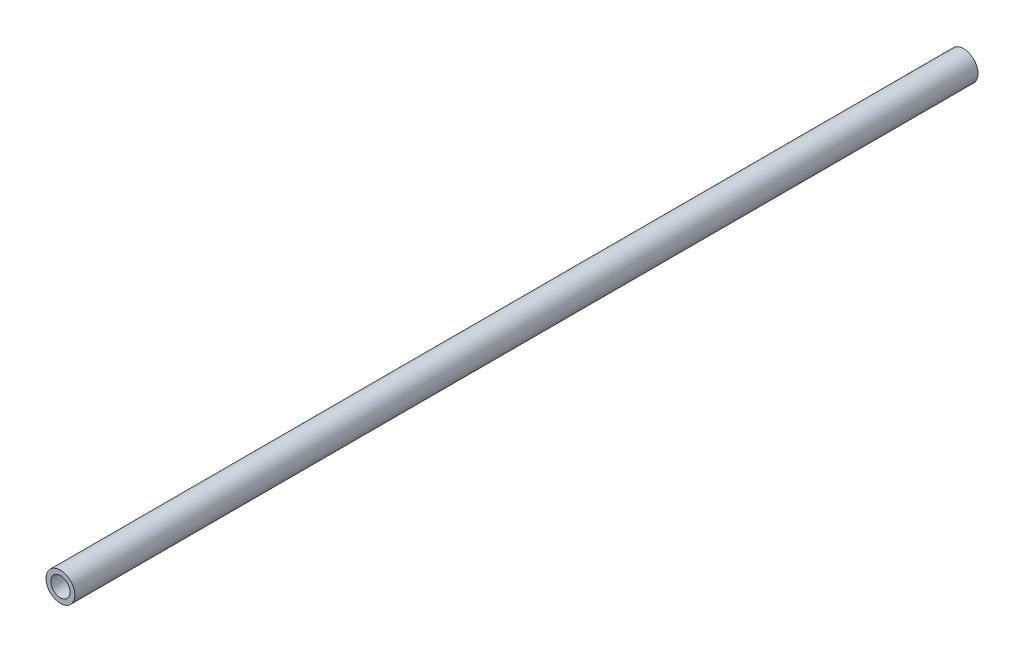
ISO-10303-21;
HEADER;
FILE_DESCRIPTION(('STEP AP214'),'2;1');
FILE_NAME('part.step','',(''),(''),'','','');
FILE_SCHEMA(('AUTOMOTIVE_DESIGN { 1 0 10303 214 1 1 1 1 }'));
ENDSEC;
DATA;
#1=APPLICATION_CONTEXT('core data for automotive mechanical design processes');
#2=APPLICATION_PROTOCOL_DEFINITION('international standard','automotive_design',2000,#1);
#3=PRODUCT_CONTEXT('',#1,'mechanical');
#4=PRODUCT('Part','Part','',(#3));
#5=PRODUCT_RELATED_PRODUCT_CATEGORY('part','',(#4));
#6=PRODUCT_DEFINITION_FORMATION('','',#4);
#7=PRODUCT_DEFINITION_CONTEXT('part definition',#1,'design');
#8=PRODUCT_DEFINITION('design','',#6,#7);
#9=PRODUCT_DEFINITION_SHAPE('','',#8);
#10=(LENGTH_UNIT() NAMED_UNIT(*) SI_UNIT(.MILLI.,.METRE.));
#11=(NAMED_UNIT(*) PLANE_ANGLE_UNIT() SI_UNIT($,.RADIAN.));
#12=(NAMED_UNIT(*) SI_UNIT($,.STERADIAN.) SOLID_ANGLE_UNIT());
#13=UNCERTAINTY_MEASURE_WITH_UNIT(LENGTH_MEASURE(1.E-05),#10,'distance_accuracy_value','');
#14=(GEOMETRIC_REPRESENTATION_CONTEXT(3) GLOBAL_UNCERTAINTY_ASSIGNED_CONTEXT((#13)) GLOBAL_UNIT_ASSIGNED_CONTEXT((#10,
#11,#12)) REPRESENTATION_CONTEXT('',''));
#15=CARTESIAN_POINT('',(0.,0.,0.));
#16=DIRECTION('',(0.,0.,1.));
#17=DIRECTION('',(1.,0.,0.));
#18=AXIS2_PLACEMENT_3D('',#15,#16,#17);
#19=CARTESIAN_POINT('',(390.761403900086,31.0815288811455,470.));
#20=DIRECTION('',(0.,0.,1.));
#21=DIRECTION('',(1.,0.,0.));
#22=AXIS2_PLACEMENT_3D('',#19,#20,#21);
#23=PLANE('',#22);
#24=CARTESIAN_POINT('',(390.761403900086,31.0815288811455,470.));
#25=DIRECTION('',(0.,0.,1.));
#26=DIRECTION('',(1.,0.,0.));
#27=AXIS2_PLACEMENT_3D('',#24,#25,#26);
#28=CIRCLE('',#27,7.50000000000001);
#29=CARTESIAN_POINT('',(383.261403900086,31.0815288811455,470.));
#30=VERTEX_POINT('',#29);
#31=EDGE_CURVE('E10',#30,#30,#28,.T.);
#32=ORIENTED_EDGE('',*,*,#31,.T.);
#33=EDGE_LOOP('',(#32));
#34=FACE_BOUND('',#33,.T.);
#35=CARTESIAN_POINT('',(390.761403900086,31.0815288811455,470.));
#36=DIRECTION('',(0.,0.,1.));
#37=DIRECTION('',(1.,0.,0.));
#38=AXIS2_PLACEMENT_3D('',#35,#36,#37);
#39=CIRCLE('',#38,4.99999999999999);
#40=CARTESIAN_POINT('',(385.761403900086,31.0815288811455,470.));
#41=VERTEX_POINT('',#40);
#42=EDGE_CURVE('E40',#41,#41,#39,.T.);
#43=ORIENTED_EDGE('',*,*,#42,.F.);
#44=EDGE_LOOP('',(#43));
#45=FACE_BOUND('',#44,.T.);
#46=ADVANCED_FACE('F29',(#34,#45),#23,.T.);
#47=CARTESIAN_POINT('',(390.761403900086,31.0815288811455,0.));
#48=DIRECTION('',(0.,0.,1.));
#49=DIRECTION('',(1.,0.,0.));
#50=AXIS2_PLACEMENT_3D('',#47,#48,#49);
#51=PLANE('',#50);
#52=CARTESIAN_POINT('',(390.761403900086,31.0815288811455,0.));
#53=DIRECTION('',(0.,0.,1.));
#54=DIRECTION('',(1.,0.,0.));
#55=AXIS2_PLACEMENT_3D('',#52,#53,#54);
#56=CIRCLE('',#55,7.50000000000001);
#57=CARTESIAN_POINT('',(383.261403900086,31.0815288811455,0.));
#58=VERTEX_POINT('',#57);
#59=EDGE_CURVE('E33',#58,#58,#56,.T.);
#60=ORIENTED_EDGE('',*,*,#59,.F.);
#61=EDGE_LOOP('',(#60));
#62=FACE_BOUND('',#61,.T.);
#63=CARTESIAN_POINT('',(390.761403900086,31.0815288811455,0.));
#64=DIRECTION('',(0.,0.,1.));
#65=DIRECTION('',(1.,0.,0.));
#66=AXIS2_PLACEMENT_3D('',#63,#64,#65);
#67=CIRCLE('',#66,4.99999999999999);
#68=CARTESIAN_POINT('',(385.761403900086,31.0815288811455,0.));
#69=VERTEX_POINT('',#68);
#70=EDGE_CURVE('E42',#69,#69,#67,.T.);
#71=ORIENTED_EDGE('',*,*,#70,.T.);
#72=EDGE_LOOP('',(#71));
#73=FACE_BOUND('',#72,.T.);
#74=ADVANCED_FACE('F52',(#62,#73),#51,.F.);
#75=CARTESIAN_POINT('',(390.761403900086,31.0815288811455,470.));
#76=DIRECTION('',(0.,0.,-1.));
#77=DIRECTION('',(-1.,0.,0.));
#78=AXIS2_PLACEMENT_3D('',#75,#76,#77);
#79=CYLINDRICAL_SURFACE('',#78,7.50000000000001);
#80=CARTESIAN_POINT('',(383.261403900086,31.0815288811455,470.));
#81=CARTESIAN_POINT('',(383.261403900086,31.0815288811455,465.104166666667));
#82=CARTESIAN_POINT('',(383.261403900086,31.0815288811455,460.208333333333));
#83=CARTESIAN_POINT('',(383.261403900086,31.0815288811455,450.416666666667));
#84=CARTESIAN_POINT('',(383.261403900086,31.0815288811455,445.520833333333));
#85=CARTESIAN_POINT('',(383.261403900086,31.0815288811455,435.729166666667));
#86=CARTESIAN_POINT('',(383.261403900086,31.0815288811455,430.833333333333));
#87=CARTESIAN_POINT('',(383.261403900086,31.0815288811455,421.041666666667));
#88=CARTESIAN_POINT('',(383.261403900086,31.0815288811455,416.145833333333));
#89=CARTESIAN_POINT('',(383.261403900086,31.0815288811455,406.354166666667));
#90=CARTESIAN_POINT('',(383.261403900086,31.0815288811455,401.458333333333));
#91=CARTESIAN_POINT('',(383.261403900086,31.0815288811455,391.666666666667));
#92=CARTESIAN_POINT('',(383.261403900086,31.0815288811455,386.770833333333));
#93=CARTESIAN_POINT('',(383.261403900086,31.0815288811455,376.979166666667));
#94=CARTESIAN_POINT('',(383.261403900086,31.0815288811455,372.083333333333));
#95=CARTESIAN_POINT('',(383.261403900086,31.0815288811455,362.291666666667));
#96=CARTESIAN_POINT('',(383.261403900086,31.0815288811455,357.395833333333));
#97=CARTESIAN_POINT('',(383.261403900086,31.0815288811455,347.604166666667));
#98=CARTESIAN_POINT('',(383.261403900086,31.0815288811455,342.708333333333));
#99=CARTESIAN_POINT('',(383.261403900086,31.0815288811455,332.916666666667));
#100=CARTESIAN_POINT('',(383.261403900086,31.0815288811455,328.020833333333));
#101=CARTESIAN_POINT('',(383.261403900086,31.0815288811455,318.229166666667));
#102=CARTESIAN_POINT('',(383.261403900086,31.0815288811455,313.333333333333));
#103=CARTESIAN_POINT('',(383.261403900086,31.0815288811455,303.541666666667));
#104=CARTESIAN_POINT('',(383.261403900086,31.0815288811455,298.645833333333));
#105=CARTESIAN_POINT('',(383.261403900086,31.0815288811455,288.854166666667));
#106=CARTESIAN_POINT('',(383.261403900086,31.0815288811455,283.958333333333));
#107=CARTESIAN_POINT('',(383.261403900086,31.0815288811455,274.166666666667));
#108=CARTESIAN_POINT('',(383.261403900086,31.0815288811455,269.270833333333));
#109=CARTESIAN_POINT('',(383.261403900086,31.0815288811455,259.479166666667));
#110=CARTESIAN_POINT('',(383.261403900086,31.0815288811455,254.583333333333));
#111=CARTESIAN_POINT('',(383.261403900086,31.0815288811455,244.791666666667));
#112=CARTESIAN_POINT('',(383.261403900086,31.0815288811455,239.895833333333));
#113=CARTESIAN_POINT('',(383.261403900086,31.0815288811455,230.104166666667));
#114=CARTESIAN_POINT('',(383.261403900086,31.0815288811455,225.208333333333));
#115=CARTESIAN_POINT('',(383.261403900086,31.0815288811455,215.416666666667));
#116=CARTESIAN_POINT('',(383.261403900086,31.0815288811455,210.520833333333));
#117=CARTESIAN_POINT('',(383.261403900086,31.0815288811455,200.729166666667));
#118=CARTESIAN_POINT('',(383.261403900086,31.0815288811455,195.833333333333));
#119=CARTESIAN_POINT('',(383.261403900086,31.0815288811455,186.041666666667));
#120=CARTESIAN_POINT('',(383.261403900086,31.0815288811455,181.145833333333));
#121=CARTESIAN_POINT('',(383.261403900086,31.0815288811455,171.354166666667));
#122=CARTESIAN_POINT('',(383.261403900086,31.0815288811455,166.458333333333));
#123=CARTESIAN_POINT('',(383.261403900086,31.0815288811455,156.666666666667));
#124=CARTESIAN_POINT('',(383.261403900086,31.0815288811455,151.770833333333));
#125=CARTESIAN_POINT('',(383.261403900086,31.0815288811455,141.979166666667));
#126=CARTESIAN_POINT('',(383.261403900086,31.0815288811455,137.083333333333));
#127=CARTESIAN_POINT('',(383.261403900086,31.0815288811455,127.291666666667));
#128=CARTESIAN_POINT('',(383.261403900086,31.0815288811455,122.395833333333));
#129=CARTESIAN_POINT('',(383.261403900086,31.0815288811455,112.604166666667));
#130=CARTESIAN_POINT('',(383.261403900086,31.0815288811455,107.708333333333));
#131=CARTESIAN_POINT('',(383.261403900086,31.0815288811455,97.9166666666666));
#132=CARTESIAN_POINT('',(383.261403900086,31.0815288811455,93.0208333333333));
#133=CARTESIAN_POINT('',(383.261403900086,31.0815288811455,83.2291666666666));
#134=CARTESIAN_POINT('',(383.261403900086,31.0815288811455,78.3333333333333));
#135=CARTESIAN_POINT('',(383.261403900086,31.0815288811455,68.5416666666666));
#136=CARTESIAN_POINT('',(383.261403900086,31.0815288811455,63.6458333333333));
#137=CARTESIAN_POINT('',(383.261403900086,31.0815288811455,53.8541666666666));
#138=CARTESIAN_POINT('',(383.261403900086,31.0815288811455,48.9583333333333));
#139=CARTESIAN_POINT('',(383.261403900086,31.0815288811455,39.1666666666666));
#140=CARTESIAN_POINT('',(383.261403900086,31.0815288811455,34.2708333333333));
#141=CARTESIAN_POINT('',(383.261403900086,31.0815288811455,24.4791666666666));
#142=CARTESIAN_POINT('',(383.261403900086,31.0815288811455,19.5833333333333));
#143=CARTESIAN_POINT('',(383.261403900086,31.0815288811455,9.79166666666662));
#144=CARTESIAN_POINT('',(383.261403900086,31.0815288811455,4.89583333333328));
#145=CARTESIAN_POINT('',(383.261403900086,31.0815288811455,0.));
#146=B_SPLINE_CURVE_WITH_KNOTS('',3,(#80,#81,#82,#83,#84,#85,#86,#87,#88,#89,#90,#91,#92,#93,
#94,#95,#96,#97,#98,#99,#100,#101,#102,#103,#104,#105,#106,#107,#108,#109,#110,#111,#112,#113,
#114,#115,#116,#117,#118,#119,#120,#121,#122,#123,#124,#125,#126,#127,#128,#129,#130,#131,#132,
#133,#134,#135,#136,#137,#138,#139,#140,#141,#142,#143,#144,#145),.UNSPECIFIED.,.F.,.F.,(4,2,2,
2,2,2,2,2,2,2,2,2,2,2,2,2,2,2,2,2,2,2,2,2,2,2,2,2,2,2,2,2,4),(0.,14.6875,29.375,44.0625,58.75,
73.4375,88.125,102.8125,117.5,132.1875,146.875,161.5625,176.25,190.9375,205.625,220.3125,235.,
249.6875,264.375,279.0625,293.75,308.4375,323.125,337.8125,352.5,367.1875,381.875,396.5625,
411.25,425.9375,440.625,455.3125,470.),.UNSPECIFIED.);
#147=EDGE_CURVE('BSEAM31',#30,#58,#146,.T.);
#148=ORIENTED_EDGE('',*,*,#31,.F.);
#149=ORIENTED_EDGE('',*,*,#59,.T.);
#150=ORIENTED_EDGE('',*,*,#147,.T.);
#151=ORIENTED_EDGE('',*,*,#147,.F.);
#152=EDGE_LOOP('',(#148,#150,#149,#151));
#153=FACE_BOUND('',#152,.T.);
#154=ADVANCED_FACE('F31',(#153),#79,.T.);
#155=CARTESIAN_POINT('',(390.761403900086,31.0815288811455,470.));
#156=DIRECTION('',(0.,0.,-1.));
#157=DIRECTION('',(-1.,0.,0.));
#158=AXIS2_PLACEMENT_3D('',#155,#156,#157);
#159=CYLINDRICAL_SURFACE('',#158,4.99999999999999);
#160=CARTESIAN_POINT('',(385.761403900086,31.0815288811455,470.));
#161=CARTESIAN_POINT('',(385.761403900086,31.0815288811455,465.104166666667));
#162=CARTESIAN_POINT('',(385.761403900086,31.0815288811455,460.208333333333));
#163=CARTESIAN_POINT('',(385.761403900086,31.0815288811455,450.416666666667));
#164=CARTESIAN_POINT('',(385.761403900086,31.0815288811455,445.520833333333));
#165=CARTESIAN_POINT('',(385.761403900086,31.0815288811455,435.729166666667));
#166=CARTESIAN_POINT('',(385.761403900086,31.0815288811455,430.833333333333));
#167=CARTESIAN_POINT('',(385.761403900086,31.0815288811455,421.041666666667));
#168=CARTESIAN_POINT('',(385.761403900086,31.0815288811455,416.145833333333));
#169=CARTESIAN_POINT('',(385.761403900086,31.0815288811455,406.354166666667));
#170=CARTESIAN_POINT('',(385.761403900086,31.0815288811455,401.458333333333));
#171=CARTESIAN_POINT('',(385.761403900086,31.0815288811455,391.666666666667));
#172=CARTESIAN_POINT('',(385.761403900086,31.0815288811455,386.770833333333));
#173=CARTESIAN_POINT('',(385.761403900086,31.0815288811455,376.979166666667));
#174=CARTESIAN_POINT('',(385.761403900086,31.0815288811455,372.083333333333));
#175=CARTESIAN_POINT('',(385.761403900086,31.0815288811455,362.291666666667));
#176=CARTESIAN_POINT('',(385.761403900086,31.0815288811455,357.395833333333));
#177=CARTESIAN_POINT('',(385.761403900086,31.0815288811455,347.604166666667));
#178=CARTESIAN_POINT('',(385.761403900086,31.0815288811455,342.708333333333));
#179=CARTESIAN_POINT('',(385.761403900086,31.0815288811455,332.916666666667));
#180=CARTESIAN_POINT('',(385.761403900086,31.0815288811455,328.020833333333));
#181=CARTESIAN_POINT('',(385.761403900086,31.0815288811455,318.229166666667));
#182=CARTESIAN_POINT('',(385.761403900086,31.0815288811455,313.333333333333));
#183=CARTESIAN_POINT('',(385.761403900086,31.0815288811455,303.541666666667));
#184=CARTESIAN_POINT('',(385.761403900086,31.0815288811455,298.645833333333));
#185=CARTESIAN_POINT('',(385.761403900086,31.0815288811455,288.854166666667));
#186=CARTESIAN_POINT('',(385.761403900086,31.0815288811455,283.958333333333));
#187=CARTESIAN_POINT('',(385.761403900086,31.0815288811455,274.166666666667));
#188=CARTESIAN_POINT('',(385.761403900086,31.0815288811455,269.270833333333));
#189=CARTESIAN_POINT('',(385.761403900086,31.0815288811455,259.479166666667));
#190=CARTESIAN_POINT('',(385.761403900086,31.0815288811455,254.583333333333));
#191=CARTESIAN_POINT('',(385.761403900086,31.0815288811455,244.791666666667));
#192=CARTESIAN_POINT('',(385.761403900086,31.0815288811455,239.895833333333));
#193=CARTESIAN_POINT('',(385.761403900086,31.0815288811455,230.104166666667));
#194=CARTESIAN_POINT('',(385.761403900086,31.0815288811455,225.208333333333));
#195=CARTESIAN_POINT('',(385.761403900086,31.0815288811455,215.416666666667));
#196=CARTESIAN_POINT('',(385.761403900086,31.0815288811455,210.520833333333));
#197=CARTESIAN_POINT('',(385.761403900086,31.0815288811455,200.729166666667));
#198=CARTESIAN_POINT('',(385.761403900086,31.0815288811455,195.833333333333));
#199=CARTESIAN_POINT('',(385.761403900086,31.0815288811455,186.041666666667));
#200=CARTESIAN_POINT('',(385.761403900086,31.0815288811455,181.145833333333));
#201=CARTESIAN_POINT('',(385.761403900086,31.0815288811455,171.354166666667));
#202=CARTESIAN_POINT('',(385.761403900086,31.0815288811455,166.458333333333));
#203=CARTESIAN_POINT('',(385.761403900086,31.0815288811455,156.666666666667));
#204=CARTESIAN_POINT('',(385.761403900086,31.0815288811455,151.770833333333));
#205=CARTESIAN_POINT('',(385.761403900086,31.0815288811455,141.979166666667));
#206=CARTESIAN_POINT('',(385.761403900086,31.0815288811455,137.083333333333));
#207=CARTESIAN_POINT('',(385.761403900086,31.0815288811455,127.291666666667));
#208=CARTESIAN_POINT('',(385.761403900086,31.0815288811455,122.395833333333));
#209=CARTESIAN_POINT('',(385.761403900086,31.0815288811455,112.604166666667));
#210=CARTESIAN_POINT('',(385.761403900086,31.0815288811455,107.708333333333));
#211=CARTESIAN_POINT('',(385.761403900086,31.0815288811455,97.9166666666666));
#212=CARTESIAN_POINT('',(385.761403900086,31.0815288811455,93.0208333333333));
#213=CARTESIAN_POINT('',(385.761403900086,31.0815288811455,83.2291666666666));
#214=CARTESIAN_POINT('',(385.761403900086,31.0815288811455,78.3333333333333));
#215=CARTESIAN_POINT('',(385.761403900086,31.0815288811455,68.5416666666666));
#216=CARTESIAN_POINT('',(385.761403900086,31.0815288811455,63.6458333333333));
#217=CARTESIAN_POINT('',(385.761403900086,31.0815288811455,53.8541666666666));
#218=CARTESIAN_POINT('',(385.761403900086,31.0815288811455,48.9583333333333));
#219=CARTESIAN_POINT('',(385.761403900086,31.0815288811455,39.1666666666666));
#220=CARTESIAN_POINT('',(385.761403900086,31.0815288811455,34.2708333333333));
#221=CARTESIAN_POINT('',(385.761403900086,31.0815288811455,24.4791666666666));
#222=CARTESIAN_POINT('',(385.761403900086,31.0815288811455,19.5833333333333));
#223=CARTESIAN_POINT('',(385.761403900086,31.0815288811455,9.79166666666662));
#224=CARTESIAN_POINT('',(385.761403900086,31.0815288811455,4.89583333333328));
#225=CARTESIAN_POINT('',(385.761403900086,31.0815288811455,0.));
#226=B_SPLINE_CURVE_WITH_KNOTS('',3,(#160,#161,#162,#163,#164,#165,#166,#167,#168,#169,#170,
#171,#172,#173,#174,#175,#176,#177,#178,#179,#180,#181,#182,#183,#184,#185,#186,#187,#188,#189,
#190,#191,#192,#193,#194,#195,#196,#197,#198,#199,#200,#201,#202,#203,#204,#205,#206,#207,#208,
#209,#210,#211,#212,#213,#214,#215,#216,#217,#218,#219,#220,#221,#222,#223,#224,#225),
.UNSPECIFIED.,.F.,.F.,(4,2,2,2,2,2,2,2,2,2,2,2,2,2,2,2,2,2,2,2,2,2,2,2,2,2,2,2,2,2,2,2,4),(0.,
14.6875,29.375,44.0625,58.75,73.4375,88.125,102.8125,117.5,132.1875,146.875,161.5625,176.25,
190.9375,205.625,220.3125,235.,249.6875,264.375,279.0625,293.75,308.4375,323.125,337.8125,352.5,
367.1875,381.875,396.5625,411.25,425.9375,440.625,455.3125,470.),.UNSPECIFIED.);
#227=EDGE_CURVE('BSEAM48',#41,#69,#226,.T.);
#228=ORIENTED_EDGE('',*,*,#42,.T.);
#229=ORIENTED_EDGE('',*,*,#70,.F.);
#230=ORIENTED_EDGE('',*,*,#227,.T.);
#231=ORIENTED_EDGE('',*,*,#227,.F.);
#232=EDGE_LOOP('',(#228,#230,#229,#231));
#233=FACE_BOUND('',#232,.T.);
#234=ADVANCED_FACE('F48',(#233),#159,.F.);
#235=CLOSED_SHELL('',(#46,#74,#154,#234));
#236=MANIFOLD_SOLID_BREP('B2',#235);
#237=ADVANCED_BREP_SHAPE_REPRESENTATION('',(#18,#236),#14);
#238=SHAPE_DEFINITION_REPRESENTATION(#9,#237);
ENDSEC;
END-ISO-10303-21;
